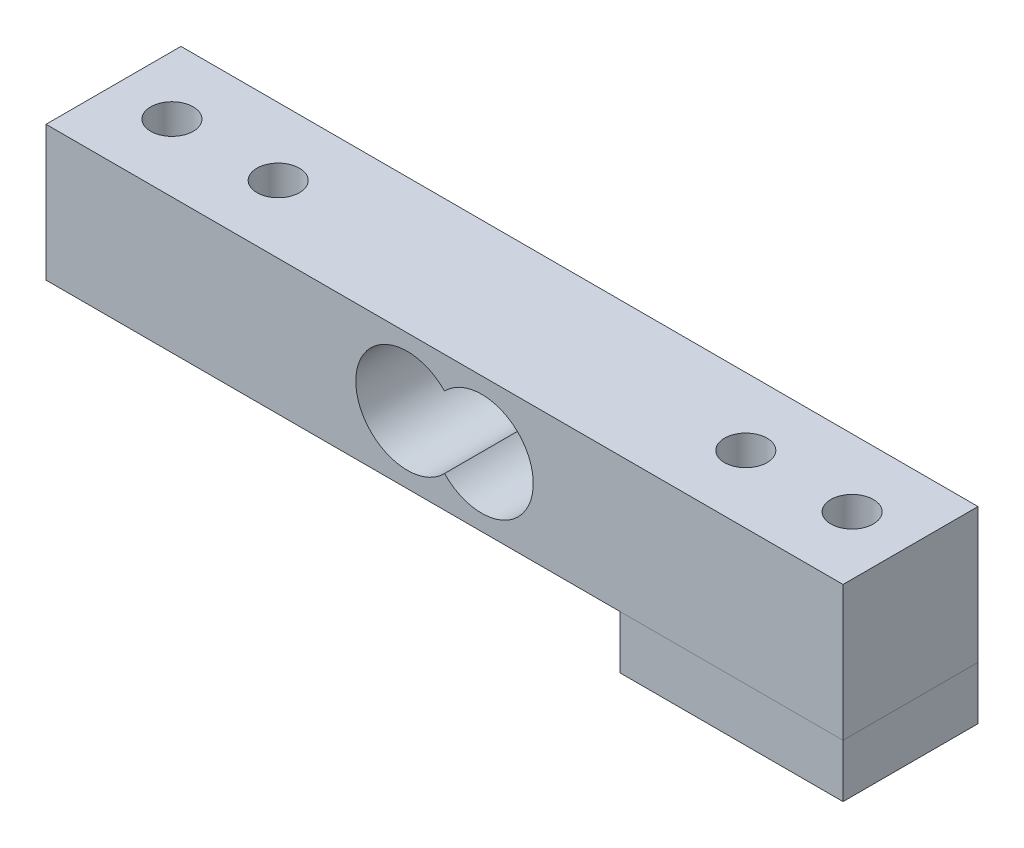
ISO-10303-21;
HEADER;
FILE_DESCRIPTION(('STEP AP214'),'2;1');
FILE_NAME('part.step','',(''),(''),'','','');
FILE_SCHEMA(('AUTOMOTIVE_DESIGN { 1 0 10303 214 1 1 1 1 }'));
ENDSEC;
DATA;
#1=APPLICATION_CONTEXT('core data for automotive mechanical design processes');
#2=APPLICATION_PROTOCOL_DEFINITION('international standard','automotive_design',2000,#1);
#3=PRODUCT_CONTEXT('',#1,'mechanical');
#4=PRODUCT('Part','Part','',(#3));
#5=PRODUCT_RELATED_PRODUCT_CATEGORY('part','',(#4));
#6=PRODUCT_DEFINITION_FORMATION('','',#4);
#7=PRODUCT_DEFINITION_CONTEXT('part definition',#1,'design');
#8=PRODUCT_DEFINITION('design','',#6,#7);
#9=PRODUCT_DEFINITION_SHAPE('','',#8);
#10=(LENGTH_UNIT() NAMED_UNIT(*) SI_UNIT(.MILLI.,.METRE.));
#11=(NAMED_UNIT(*) PLANE_ANGLE_UNIT() SI_UNIT($,.RADIAN.));
#12=(NAMED_UNIT(*) SI_UNIT($,.STERADIAN.) SOLID_ANGLE_UNIT());
#13=UNCERTAINTY_MEASURE_WITH_UNIT(LENGTH_MEASURE(1.E-05),#10,'distance_accuracy_value','');
#14=(GEOMETRIC_REPRESENTATION_CONTEXT(3) GLOBAL_UNCERTAINTY_ASSIGNED_CONTEXT((#13)) GLOBAL_UNIT_ASSIGNED_CONTEXT((#10,
#11,#12)) REPRESENTATION_CONTEXT('',''));
#15=CARTESIAN_POINT('',(0.,0.,0.));
#16=DIRECTION('',(0.,0.,1.));
#17=DIRECTION('',(1.,0.,0.));
#18=AXIS2_PLACEMENT_3D('',#15,#16,#17);
#19=CARTESIAN_POINT('',(0.,-5.,0.));
#20=DIRECTION('',(0.,-1.,0.));
#21=DIRECTION('',(0.,0.,-1.));
#22=AXIS2_PLACEMENT_3D('',#19,#20,#21);
#23=PLANE('',#22);
#24=CARTESIAN_POINT('',(32.,-5.,0.));
#25=DIRECTION('',(0.,-1.,0.));
#26=DIRECTION('',(0.,0.,-1.));
#27=AXIS2_PLACEMENT_3D('',#24,#25,#26);
#28=CIRCLE('',#27,2.25);
#29=CARTESIAN_POINT('',(32.,-5.,-2.25));
#30=VERTEX_POINT('',#29);
#31=EDGE_CURVE('E116',#30,#30,#28,.T.);
#32=ORIENTED_EDGE('',*,*,#31,.F.);
#33=EDGE_LOOP('',(#32));
#34=FACE_BOUND('',#33,.T.);
#35=DIRECTION('',(0.,0.,1.));
#36=VECTOR('',#35,1.);
#37=CARTESIAN_POINT('',(37.5,-5.,-6.35));
#38=LINE('',#37,#36);
#39=CARTESIAN_POINT('',(37.5,-5.,-6.35));
#40=VERTEX_POINT('',#39);
#41=CARTESIAN_POINT('',(37.5,-5.,6.35));
#42=VERTEX_POINT('',#41);
#43=EDGE_CURVE('E101',#40,#42,#38,.T.);
#44=ORIENTED_EDGE('',*,*,#43,.T.);
#45=DIRECTION('',(-1.,0.,0.));
#46=VECTOR('',#45,1.);
#47=CARTESIAN_POINT('',(37.5,-5.,6.35));
#48=LINE('',#47,#46);
#49=CARTESIAN_POINT('',(16.5,-5.,6.35));
#50=VERTEX_POINT('',#49);
#51=EDGE_CURVE('E96',#42,#50,#48,.T.);
#52=ORIENTED_EDGE('',*,*,#51,.T.);
#53=DIRECTION('',(0.,0.,-1.));
#54=VECTOR('',#53,1.);
#55=CARTESIAN_POINT('',(16.5,-5.,-6.35));
#56=LINE('',#55,#54);
#57=CARTESIAN_POINT('',(16.5,-5.,-6.35));
#58=VERTEX_POINT('',#57);
#59=EDGE_CURVE('E99',#50,#58,#56,.T.);
#60=ORIENTED_EDGE('',*,*,#59,.T.);
#61=DIRECTION('',(1.,0.,0.));
#62=VECTOR('',#61,1.);
#63=CARTESIAN_POINT('',(37.5,-5.,-6.35));
#64=LINE('',#63,#62);
#65=EDGE_CURVE('E66',#58,#40,#64,.T.);
#66=ORIENTED_EDGE('',*,*,#65,.T.);
#67=EDGE_LOOP('',(#44,#52,#60,#66));
#68=FACE_BOUND('',#67,.T.);
#69=CARTESIAN_POINT('',(22.,-5.,0.));
#70=DIRECTION('',(0.,-1.,0.));
#71=DIRECTION('',(0.,0.,-1.));
#72=AXIS2_PLACEMENT_3D('',#69,#70,#71);
#73=CIRCLE('',#72,2.25);
#74=CARTESIAN_POINT('',(22.,-5.,-2.25));
#75=VERTEX_POINT('',#74);
#76=EDGE_CURVE('E131',#75,#75,#73,.T.);
#77=ORIENTED_EDGE('',*,*,#76,.F.);
#78=EDGE_LOOP('',(#77));
#79=FACE_BOUND('',#78,.T.);
#80=ADVANCED_FACE('F49',(#34,#68,#79),#23,.T.);
#81=CARTESIAN_POINT('',(0.,0.,0.));
#82=DIRECTION('',(0.,-1.,0.));
#83=DIRECTION('',(0.,0.,-1.));
#84=AXIS2_PLACEMENT_3D('',#81,#82,#83);
#85=PLANE('',#84);
#86=DIRECTION('',(0.,0.,1.));
#87=VECTOR('',#86,1.);
#88=CARTESIAN_POINT('',(37.5,0.,-6.35));
#89=LINE('',#88,#87);
#90=CARTESIAN_POINT('',(37.5,0.,-6.35));
#91=VERTEX_POINT('',#90);
#92=CARTESIAN_POINT('',(37.5,0.,6.35));
#93=VERTEX_POINT('',#92);
#94=EDGE_CURVE('E113',#91,#93,#89,.T.);
#95=ORIENTED_EDGE('',*,*,#94,.F.);
#96=DIRECTION('',(1.,0.,0.));
#97=VECTOR('',#96,1.);
#98=CARTESIAN_POINT('',(37.5,0.,-6.35));
#99=LINE('',#98,#97);
#100=CARTESIAN_POINT('',(16.5,0.,-6.35));
#101=VERTEX_POINT('',#100);
#102=EDGE_CURVE('E89',#101,#91,#99,.T.);
#103=ORIENTED_EDGE('',*,*,#102,.F.);
#104=DIRECTION('',(0.,0.,-1.));
#105=VECTOR('',#104,1.);
#106=CARTESIAN_POINT('',(16.5,0.,-6.35));
#107=LINE('',#106,#105);
#108=CARTESIAN_POINT('',(16.5,0.,6.35));
#109=VERTEX_POINT('',#108);
#110=EDGE_CURVE('E83',#109,#101,#107,.T.);
#111=ORIENTED_EDGE('',*,*,#110,.F.);
#112=DIRECTION('',(-1.,0.,0.));
#113=VECTOR('',#112,1.);
#114=CARTESIAN_POINT('',(37.5,0.,6.35));
#115=LINE('',#114,#113);
#116=EDGE_CURVE('E105',#93,#109,#115,.T.);
#117=ORIENTED_EDGE('',*,*,#116,.F.);
#118=EDGE_LOOP('',(#95,#103,#111,#117));
#119=FACE_BOUND('',#118,.T.);
#120=CARTESIAN_POINT('',(32.,0.,0.));
#121=DIRECTION('',(0.,-1.,0.));
#122=DIRECTION('',(0.,0.,-1.));
#123=AXIS2_PLACEMENT_3D('',#120,#121,#122);
#124=CIRCLE('',#123,2.25);
#125=CARTESIAN_POINT('',(32.,0.,-2.25));
#126=VERTEX_POINT('',#125);
#127=EDGE_CURVE('E128',#126,#126,#124,.T.);
#128=ORIENTED_EDGE('',*,*,#127,.T.);
#129=EDGE_LOOP('',(#128));
#130=FACE_BOUND('',#129,.T.);
#131=CARTESIAN_POINT('',(22.,0.,0.));
#132=DIRECTION('',(0.,-1.,0.));
#133=DIRECTION('',(0.,0.,-1.));
#134=AXIS2_PLACEMENT_3D('',#131,#132,#133);
#135=CIRCLE('',#134,2.25);
#136=CARTESIAN_POINT('',(22.,0.,-2.25));
#137=VERTEX_POINT('',#136);
#138=EDGE_CURVE('E134',#137,#137,#135,.T.);
#139=ORIENTED_EDGE('',*,*,#138,.T.);
#140=EDGE_LOOP('',(#139));
#141=FACE_BOUND('',#140,.T.);
#142=ADVANCED_FACE('F124',(#119,#130,#141),#85,.F.);
#143=CARTESIAN_POINT('',(37.5,-5.,-6.35));
#144=DIRECTION('',(-1.,0.,0.));
#145=DIRECTION('',(0.,0.,1.));
#146=AXIS2_PLACEMENT_3D('',#143,#144,#145);
#147=PLANE('',#146);
#148=ORIENTED_EDGE('',*,*,#94,.T.);
#149=DIRECTION('',(0.,1.,0.));
#150=VECTOR('',#149,1.);
#151=CARTESIAN_POINT('',(37.5,-5.,6.35));
#152=LINE('',#151,#150);
#153=EDGE_CURVE('E12',#42,#93,#152,.T.);
#154=ORIENTED_EDGE('',*,*,#153,.F.);
#155=ORIENTED_EDGE('',*,*,#43,.F.);
#156=DIRECTION('',(0.,1.,0.));
#157=VECTOR('',#156,1.);
#158=CARTESIAN_POINT('',(37.5,-5.,-6.35));
#159=LINE('',#158,#157);
#160=EDGE_CURVE('E109',#40,#91,#159,.T.);
#161=ORIENTED_EDGE('',*,*,#160,.T.);
#162=EDGE_LOOP('',(#148,#154,#155,#161));
#163=FACE_BOUND('',#162,.T.);
#164=ADVANCED_FACE('F51',(#163),#147,.F.);
#165=CARTESIAN_POINT('',(37.5,-5.,6.35));
#166=DIRECTION('',(0.,0.,-1.));
#167=DIRECTION('',(-1.,0.,0.));
#168=AXIS2_PLACEMENT_3D('',#165,#166,#167);
#169=PLANE('',#168);
#170=ORIENTED_EDGE('',*,*,#116,.T.);
#171=DIRECTION('',(0.,1.,0.));
#172=VECTOR('',#171,1.);
#173=CARTESIAN_POINT('',(16.5,-5.,6.35));
#174=LINE('',#173,#172);
#175=EDGE_CURVE('E58',#50,#109,#174,.T.);
#176=ORIENTED_EDGE('',*,*,#175,.F.);
#177=ORIENTED_EDGE('',*,*,#51,.F.);
#178=ORIENTED_EDGE('',*,*,#153,.T.);
#179=EDGE_LOOP('',(#170,#176,#177,#178));
#180=FACE_BOUND('',#179,.T.);
#181=ADVANCED_FACE('F104',(#180),#169,.F.);
#182=CARTESIAN_POINT('',(16.5,-5.,-6.35));
#183=DIRECTION('',(1.,0.,0.));
#184=DIRECTION('',(0.,0.,-1.));
#185=AXIS2_PLACEMENT_3D('',#182,#183,#184);
#186=PLANE('',#185);
#187=ORIENTED_EDGE('',*,*,#110,.T.);
#188=DIRECTION('',(0.,1.,0.));
#189=VECTOR('',#188,1.);
#190=CARTESIAN_POINT('',(16.5,-5.,-6.35));
#191=LINE('',#190,#189);
#192=EDGE_CURVE('E106',#58,#101,#191,.T.);
#193=ORIENTED_EDGE('',*,*,#192,.F.);
#194=ORIENTED_EDGE('',*,*,#59,.F.);
#195=ORIENTED_EDGE('',*,*,#175,.T.);
#196=EDGE_LOOP('',(#187,#193,#194,#195));
#197=FACE_BOUND('',#196,.T.);
#198=ADVANCED_FACE('F107',(#197),#186,.F.);
#199=CARTESIAN_POINT('',(37.5,-5.,-6.35));
#200=DIRECTION('',(0.,0.,1.));
#201=DIRECTION('',(1.,0.,0.));
#202=AXIS2_PLACEMENT_3D('',#199,#200,#201);
#203=PLANE('',#202);
#204=ORIENTED_EDGE('',*,*,#102,.T.);
#205=ORIENTED_EDGE('',*,*,#160,.F.);
#206=ORIENTED_EDGE('',*,*,#65,.F.);
#207=ORIENTED_EDGE('',*,*,#192,.T.);
#208=EDGE_LOOP('',(#204,#205,#206,#207));
#209=FACE_BOUND('',#208,.T.);
#210=ADVANCED_FACE('F121',(#209),#203,.F.);
#211=CARTESIAN_POINT('',(32.,-5.,0.));
#212=DIRECTION('',(0.,1.,0.));
#213=DIRECTION('',(0.,0.,1.));
#214=AXIS2_PLACEMENT_3D('',#211,#212,#213);
#215=CYLINDRICAL_SURFACE('',#214,2.25);
#216=ORIENTED_EDGE('',*,*,#31,.T.);
#217=EDGE_LOOP('',(#216));
#218=FACE_BOUND('',#217,.T.);
#219=ORIENTED_EDGE('',*,*,#127,.F.);
#220=EDGE_LOOP('',(#219));
#221=FACE_BOUND('',#220,.T.);
#222=ADVANCED_FACE('F151',(#218,#221),#215,.F.);
#223=CARTESIAN_POINT('',(22.,-5.,0.));
#224=DIRECTION('',(0.,1.,0.));
#225=DIRECTION('',(0.,0.,1.));
#226=AXIS2_PLACEMENT_3D('',#223,#224,#225);
#227=CYLINDRICAL_SURFACE('',#226,2.25);
#228=ORIENTED_EDGE('',*,*,#76,.T.);
#229=EDGE_LOOP('',(#228));
#230=FACE_BOUND('',#229,.T.);
#231=ORIENTED_EDGE('',*,*,#138,.F.);
#232=EDGE_LOOP('',(#231));
#233=FACE_BOUND('',#232,.T.);
#234=ADVANCED_FACE('F140',(#230,#233),#227,.F.);
#235=CLOSED_SHELL('',(#80,#142,#164,#181,#198,#210,#222,#234));
#236=MANIFOLD_SOLID_BREP('B2',#235);
#237=CARTESIAN_POINT('',(0.,12.7,6.35));
#238=DIRECTION('',(0.,0.,-1.));
#239=DIRECTION('',(-1.,0.,0.));
#240=AXIS2_PLACEMENT_3D('',#237,#238,#239);
#241=PLANE('',#240);
#242=CARTESIAN_POINT('',(-3.5,6.35,6.35));
#243=DIRECTION('',(0.,0.,1.));
#244=DIRECTION('',(1.,0.,0.));
#245=AXIS2_PLACEMENT_3D('',#242,#243,#244);
#246=CIRCLE('',#245,4.85);
#247=CARTESIAN_POINT('',(0.,9.70745439283991,6.35));
#248=VERTEX_POINT('',#247);
#249=CARTESIAN_POINT('',(0.,2.99254560716009,6.35));
#250=VERTEX_POINT('',#249);
#251=EDGE_CURVE('E280',#248,#250,#246,.T.);
#252=ORIENTED_EDGE('',*,*,#251,.F.);
#253=CARTESIAN_POINT('',(3.5,6.35,6.35));
#254=DIRECTION('',(0.,0.,1.));
#255=DIRECTION('',(1.,0.,0.));
#256=AXIS2_PLACEMENT_3D('',#253,#254,#255);
#257=CIRCLE('',#256,4.85);
#258=EDGE_CURVE('E230',#250,#248,#257,.T.);
#259=ORIENTED_EDGE('',*,*,#258,.F.);
#260=EDGE_LOOP('',(#252,#259));
#261=FACE_BOUND('',#260,.T.);
#262=DIRECTION('',(1.,0.,0.));
#263=VECTOR('',#262,1.);
#264=CARTESIAN_POINT('',(0.,0.,6.35));
#265=LINE('',#264,#263);
#266=CARTESIAN_POINT('',(-37.5,0.,6.35));
#267=VERTEX_POINT('',#266);
#268=CARTESIAN_POINT('',(37.5,0.,6.35));
#269=VERTEX_POINT('',#268);
#270=EDGE_CURVE('E322',#267,#269,#265,.T.);
#271=ORIENTED_EDGE('',*,*,#270,.T.);
#272=DIRECTION('',(0.,-1.,0.));
#273=VECTOR('',#272,1.);
#274=CARTESIAN_POINT('',(37.5,12.7,6.35));
#275=LINE('',#274,#273);
#276=CARTESIAN_POINT('',(37.5,12.7,6.35));
#277=VERTEX_POINT('',#276);
#278=EDGE_CURVE('E47',#277,#269,#275,.T.);
#279=ORIENTED_EDGE('',*,*,#278,.F.);
#280=DIRECTION('',(1.,0.,0.));
#281=VECTOR('',#280,1.);
#282=CARTESIAN_POINT('',(0.,12.7,6.35));
#283=LINE('',#282,#281);
#284=CARTESIAN_POINT('',(-37.5,12.7,6.35));
#285=VERTEX_POINT('',#284);
#286=EDGE_CURVE('E299',#285,#277,#283,.T.);
#287=ORIENTED_EDGE('',*,*,#286,.F.);
#288=DIRECTION('',(0.,-1.,0.));
#289=VECTOR('',#288,1.);
#290=CARTESIAN_POINT('',(-37.5,12.7,6.35));
#291=LINE('',#290,#289);
#292=EDGE_CURVE('E310',#285,#267,#291,.T.);
#293=ORIENTED_EDGE('',*,*,#292,.T.);
#294=EDGE_LOOP('',(#271,#279,#287,#293));
#295=FACE_BOUND('',#294,.T.);
#296=ADVANCED_FACE('F215',(#261,#295),#241,.F.);
#297=CARTESIAN_POINT('',(37.5,12.7,0.));
#298=DIRECTION('',(-1.,0.,0.));
#299=DIRECTION('',(0.,0.,1.));
#300=AXIS2_PLACEMENT_3D('',#297,#298,#299);
#301=PLANE('',#300);
#302=DIRECTION('',(0.,0.,-1.));
#303=VECTOR('',#302,1.);
#304=CARTESIAN_POINT('',(37.5,0.,0.));
#305=LINE('',#304,#303);
#306=CARTESIAN_POINT('',(37.5,0.,-6.35));
#307=VERTEX_POINT('',#306);
#308=EDGE_CURVE('E325',#269,#307,#305,.T.);
#309=ORIENTED_EDGE('',*,*,#308,.T.);
#310=DIRECTION('',(0.,-1.,0.));
#311=VECTOR('',#310,1.);
#312=CARTESIAN_POINT('',(37.5,12.7,-6.35));
#313=LINE('',#312,#311);
#314=CARTESIAN_POINT('',(37.5,12.7,-6.35));
#315=VERTEX_POINT('',#314);
#316=EDGE_CURVE('E223',#315,#307,#313,.T.);
#317=ORIENTED_EDGE('',*,*,#316,.F.);
#318=DIRECTION('',(0.,0.,-1.));
#319=VECTOR('',#318,1.);
#320=CARTESIAN_POINT('',(37.5,12.7,0.));
#321=LINE('',#320,#319);
#322=EDGE_CURVE('E302',#277,#315,#321,.T.);
#323=ORIENTED_EDGE('',*,*,#322,.F.);
#324=ORIENTED_EDGE('',*,*,#278,.T.);
#325=EDGE_LOOP('',(#309,#317,#323,#324));
#326=FACE_BOUND('',#325,.T.);
#327=ADVANCED_FACE('F339',(#326),#301,.F.);
#328=CARTESIAN_POINT('',(0.,12.7,-6.35));
#329=DIRECTION('',(0.,0.,-1.));
#330=DIRECTION('',(-1.,0.,0.));
#331=AXIS2_PLACEMENT_3D('',#328,#329,#330);
#332=PLANE('',#331);
#333=CARTESIAN_POINT('',(3.5,6.35,-6.35));
#334=DIRECTION('',(0.,0.,-1.));
#335=DIRECTION('',(-1.,0.,0.));
#336=AXIS2_PLACEMENT_3D('',#333,#334,#335);
#337=CIRCLE('',#336,4.85);
#338=CARTESIAN_POINT('',(0.,2.99254560716009,-6.35));
#339=VERTEX_POINT('',#338);
#340=CARTESIAN_POINT('',(0.,9.70745439283991,-6.35));
#341=VERTEX_POINT('',#340);
#342=EDGE_CURVE('E275',#339,#341,#337,.F.);
#343=ORIENTED_EDGE('',*,*,#342,.T.);
#344=CARTESIAN_POINT('',(-3.5,6.35,-6.35));
#345=DIRECTION('',(0.,0.,-1.));
#346=DIRECTION('',(-1.,0.,0.));
#347=AXIS2_PLACEMENT_3D('',#344,#345,#346);
#348=CIRCLE('',#347,4.85);
#349=EDGE_CURVE('E267',#341,#339,#348,.F.);
#350=ORIENTED_EDGE('',*,*,#349,.T.);
#351=EDGE_LOOP('',(#343,#350));
#352=FACE_BOUND('',#351,.T.);
#353=DIRECTION('',(1.,0.,0.));
#354=VECTOR('',#353,1.);
#355=CARTESIAN_POINT('',(0.,0.,-6.35));
#356=LINE('',#355,#354);
#357=CARTESIAN_POINT('',(-37.5,0.,-6.35));
#358=VERTEX_POINT('',#357);
#359=EDGE_CURVE('E328',#358,#307,#356,.T.);
#360=ORIENTED_EDGE('',*,*,#359,.F.);
#361=DIRECTION('',(0.,-1.,0.));
#362=VECTOR('',#361,1.);
#363=CARTESIAN_POINT('',(-37.5,12.7,-6.35));
#364=LINE('',#363,#362);
#365=CARTESIAN_POINT('',(-37.5,12.7,-6.35));
#366=VERTEX_POINT('',#365);
#367=EDGE_CURVE('E334',#366,#358,#364,.T.);
#368=ORIENTED_EDGE('',*,*,#367,.F.);
#369=DIRECTION('',(1.,0.,0.));
#370=VECTOR('',#369,1.);
#371=CARTESIAN_POINT('',(0.,12.7,-6.35));
#372=LINE('',#371,#370);
#373=EDGE_CURVE('E304',#366,#315,#372,.T.);
#374=ORIENTED_EDGE('',*,*,#373,.T.);
#375=ORIENTED_EDGE('',*,*,#316,.T.);
#376=EDGE_LOOP('',(#360,#368,#374,#375));
#377=FACE_BOUND('',#376,.T.);
#378=ADVANCED_FACE('F277',(#352,#377),#332,.T.);
#379=CARTESIAN_POINT('',(-32.,12.7,0.));
#380=DIRECTION('',(0.,-1.,0.));
#381=DIRECTION('',(0.,0.,-1.));
#382=AXIS2_PLACEMENT_3D('',#379,#380,#381);
#383=CYLINDRICAL_SURFACE('',#382,2.);
#384=CARTESIAN_POINT('',(-32.,12.7,0.));
#385=DIRECTION('',(0.,1.,0.));
#386=DIRECTION('',(0.,0.,1.));
#387=AXIS2_PLACEMENT_3D('',#384,#385,#386);
#388=CIRCLE('',#387,2.);
#389=CARTESIAN_POINT('',(-32.,12.7,2.));
#390=VERTEX_POINT('',#389);
#391=EDGE_CURVE('E296',#390,#390,#388,.T.);
#392=ORIENTED_EDGE('',*,*,#391,.T.);
#393=EDGE_LOOP('',(#392));
#394=FACE_BOUND('',#393,.T.);
#395=CARTESIAN_POINT('',(-32.,0.,0.));
#396=DIRECTION('',(0.,1.,0.));
#397=DIRECTION('',(0.,0.,1.));
#398=AXIS2_PLACEMENT_3D('',#395,#396,#397);
#399=CIRCLE('',#398,2.);
#400=CARTESIAN_POINT('',(-32.,0.,2.));
#401=VERTEX_POINT('',#400);
#402=EDGE_CURVE('E319',#401,#401,#399,.T.);
#403=ORIENTED_EDGE('',*,*,#402,.F.);
#404=EDGE_LOOP('',(#403));
#405=FACE_BOUND('',#404,.T.);
#406=ADVANCED_FACE('F361',(#394,#405),#383,.F.);
#407=CARTESIAN_POINT('',(-22.,12.7,0.));
#408=DIRECTION('',(0.,-1.,0.));
#409=DIRECTION('',(0.,0.,-1.));
#410=AXIS2_PLACEMENT_3D('',#407,#408,#409);
#411=CYLINDRICAL_SURFACE('',#410,2.);
#412=CARTESIAN_POINT('',(-22.,12.7,0.));
#413=DIRECTION('',(0.,1.,0.));
#414=DIRECTION('',(0.,0.,1.));
#415=AXIS2_PLACEMENT_3D('',#412,#413,#414);
#416=CIRCLE('',#415,2.);
#417=CARTESIAN_POINT('',(-22.,12.7,2.));
#418=VERTEX_POINT('',#417);
#419=EDGE_CURVE('E293',#418,#418,#416,.T.);
#420=ORIENTED_EDGE('',*,*,#419,.T.);
#421=EDGE_LOOP('',(#420));
#422=FACE_BOUND('',#421,.T.);
#423=CARTESIAN_POINT('',(-22.,0.,0.));
#424=DIRECTION('',(0.,1.,0.));
#425=DIRECTION('',(0.,0.,1.));
#426=AXIS2_PLACEMENT_3D('',#423,#424,#425);
#427=CIRCLE('',#426,2.);
#428=CARTESIAN_POINT('',(-22.,0.,2.));
#429=VERTEX_POINT('',#428);
#430=EDGE_CURVE('E316',#429,#429,#427,.T.);
#431=ORIENTED_EDGE('',*,*,#430,.F.);
#432=EDGE_LOOP('',(#431));
#433=FACE_BOUND('',#432,.T.);
#434=ADVANCED_FACE('F364',(#422,#433),#411,.F.);
#435=CARTESIAN_POINT('',(22.,12.7,0.));
#436=DIRECTION('',(0.,-1.,0.));
#437=DIRECTION('',(0.,0.,-1.));
#438=AXIS2_PLACEMENT_3D('',#435,#436,#437);
#439=CYLINDRICAL_SURFACE('',#438,2.);
#440=CARTESIAN_POINT('',(22.,12.7,0.));
#441=DIRECTION('',(0.,1.,0.));
#442=DIRECTION('',(0.,0.,1.));
#443=AXIS2_PLACEMENT_3D('',#440,#441,#442);
#444=CIRCLE('',#443,2.);
#445=CARTESIAN_POINT('',(22.,12.7,2.));
#446=VERTEX_POINT('',#445);
#447=EDGE_CURVE('E289',#446,#446,#444,.T.);
#448=ORIENTED_EDGE('',*,*,#447,.T.);
#449=EDGE_LOOP('',(#448));
#450=FACE_BOUND('',#449,.T.);
#451=CARTESIAN_POINT('',(22.,0.,0.));
#452=DIRECTION('',(0.,1.,0.));
#453=DIRECTION('',(0.,0.,1.));
#454=AXIS2_PLACEMENT_3D('',#451,#452,#453);
#455=CIRCLE('',#454,2.);
#456=CARTESIAN_POINT('',(22.,0.,2.));
#457=VERTEX_POINT('',#456);
#458=EDGE_CURVE('E313',#457,#457,#455,.T.);
#459=ORIENTED_EDGE('',*,*,#458,.F.);
#460=EDGE_LOOP('',(#459));
#461=FACE_BOUND('',#460,.T.);
#462=ADVANCED_FACE('F367',(#450,#461),#439,.F.);
#463=CARTESIAN_POINT('',(32.,12.7,0.));
#464=DIRECTION('',(0.,-1.,0.));
#465=DIRECTION('',(0.,0.,-1.));
#466=AXIS2_PLACEMENT_3D('',#463,#464,#465);
#467=CYLINDRICAL_SURFACE('',#466,2.);
#468=CARTESIAN_POINT('',(32.,12.7,0.));
#469=DIRECTION('',(0.,1.,0.));
#470=DIRECTION('',(0.,0.,1.));
#471=AXIS2_PLACEMENT_3D('',#468,#469,#470);
#472=CIRCLE('',#471,2.);
#473=CARTESIAN_POINT('',(32.,12.7,2.));
#474=VERTEX_POINT('',#473);
#475=EDGE_CURVE('E286',#474,#474,#472,.T.);
#476=ORIENTED_EDGE('',*,*,#475,.T.);
#477=EDGE_LOOP('',(#476));
#478=FACE_BOUND('',#477,.T.);
#479=CARTESIAN_POINT('',(32.,0.,0.));
#480=DIRECTION('',(0.,1.,0.));
#481=DIRECTION('',(0.,0.,1.));
#482=AXIS2_PLACEMENT_3D('',#479,#480,#481);
#483=CIRCLE('',#482,2.);
#484=CARTESIAN_POINT('',(32.,0.,2.));
#485=VERTEX_POINT('',#484);
#486=EDGE_CURVE('E285',#485,#485,#483,.T.);
#487=ORIENTED_EDGE('',*,*,#486,.F.);
#488=EDGE_LOOP('',(#487));
#489=FACE_BOUND('',#488,.T.);
#490=ADVANCED_FACE('F217',(#478,#489),#467,.F.);
#491=CARTESIAN_POINT('',(-37.5,12.7,0.));
#492=DIRECTION('',(-1.,0.,0.));
#493=DIRECTION('',(0.,0.,1.));
#494=AXIS2_PLACEMENT_3D('',#491,#492,#493);
#495=PLANE('',#494);
#496=DIRECTION('',(0.,0.,-1.));
#497=VECTOR('',#496,1.);
#498=CARTESIAN_POINT('',(-37.5,0.,0.));
#499=LINE('',#498,#497);
#500=EDGE_CURVE('E290',#267,#358,#499,.T.);
#501=ORIENTED_EDGE('',*,*,#500,.F.);
#502=ORIENTED_EDGE('',*,*,#292,.F.);
#503=DIRECTION('',(0.,0.,-1.));
#504=VECTOR('',#503,1.);
#505=CARTESIAN_POINT('',(-37.5,12.7,0.));
#506=LINE('',#505,#504);
#507=EDGE_CURVE('E307',#285,#366,#506,.T.);
#508=ORIENTED_EDGE('',*,*,#507,.T.);
#509=ORIENTED_EDGE('',*,*,#367,.T.);
#510=EDGE_LOOP('',(#501,#502,#508,#509));
#511=FACE_BOUND('',#510,.T.);
#512=ADVANCED_FACE('F346',(#511),#495,.T.);
#513=CARTESIAN_POINT('',(0.,12.7,0.));
#514=DIRECTION('',(0.,1.,0.));
#515=DIRECTION('',(0.,0.,1.));
#516=AXIS2_PLACEMENT_3D('',#513,#514,#515);
#517=PLANE('',#516);
#518=ORIENTED_EDGE('',*,*,#475,.F.);
#519=EDGE_LOOP('',(#518));
#520=FACE_BOUND('',#519,.T.);
#521=ORIENTED_EDGE('',*,*,#447,.F.);
#522=EDGE_LOOP('',(#521));
#523=FACE_BOUND('',#522,.T.);
#524=ORIENTED_EDGE('',*,*,#419,.F.);
#525=EDGE_LOOP('',(#524));
#526=FACE_BOUND('',#525,.T.);
#527=ORIENTED_EDGE('',*,*,#391,.F.);
#528=EDGE_LOOP('',(#527));
#529=FACE_BOUND('',#528,.T.);
#530=ORIENTED_EDGE('',*,*,#286,.T.);
#531=ORIENTED_EDGE('',*,*,#322,.T.);
#532=ORIENTED_EDGE('',*,*,#373,.F.);
#533=ORIENTED_EDGE('',*,*,#507,.F.);
#534=EDGE_LOOP('',(#530,#531,#532,#533));
#535=FACE_BOUND('',#534,.T.);
#536=ADVANCED_FACE('F350',(#520,#523,#526,#529,#535),#517,.T.);
#537=CARTESIAN_POINT('',(0.,0.,0.));
#538=DIRECTION('',(0.,1.,0.));
#539=DIRECTION('',(0.,0.,1.));
#540=AXIS2_PLACEMENT_3D('',#537,#538,#539);
#541=PLANE('',#540);
#542=ORIENTED_EDGE('',*,*,#486,.T.);
#543=EDGE_LOOP('',(#542));
#544=FACE_BOUND('',#543,.T.);
#545=ORIENTED_EDGE('',*,*,#458,.T.);
#546=EDGE_LOOP('',(#545));
#547=FACE_BOUND('',#546,.T.);
#548=ORIENTED_EDGE('',*,*,#430,.T.);
#549=EDGE_LOOP('',(#548));
#550=FACE_BOUND('',#549,.T.);
#551=ORIENTED_EDGE('',*,*,#402,.T.);
#552=EDGE_LOOP('',(#551));
#553=FACE_BOUND('',#552,.T.);
#554=ORIENTED_EDGE('',*,*,#270,.F.);
#555=ORIENTED_EDGE('',*,*,#500,.T.);
#556=ORIENTED_EDGE('',*,*,#359,.T.);
#557=ORIENTED_EDGE('',*,*,#308,.F.);
#558=EDGE_LOOP('',(#554,#555,#556,#557));
#559=FACE_BOUND('',#558,.T.);
#560=ADVANCED_FACE('F343',(#544,#547,#550,#553,#559),#541,.F.);
#561=CARTESIAN_POINT('',(3.5,6.35,-25.6626901285139));
#562=DIRECTION('',(0.,0.,1.));
#563=DIRECTION('',(1.,0.,0.));
#564=AXIS2_PLACEMENT_3D('',#561,#562,#563);
#565=CYLINDRICAL_SURFACE('',#564,4.85);
#566=DIRECTION('',(0.,0.,1.));
#567=VECTOR('',#566,1.);
#568=CARTESIAN_POINT('',(0.,2.99254560716009,-25.6626901285139));
#569=LINE('',#568,#567);
#570=EDGE_CURVE('E237',#339,#250,#569,.T.);
#571=ORIENTED_EDGE('',*,*,#570,.T.);
#572=ORIENTED_EDGE('',*,*,#258,.T.);
#573=DIRECTION('',(0.,0.,1.));
#574=VECTOR('',#573,1.);
#575=CARTESIAN_POINT('',(0.,9.70745439283991,-25.6626901285139));
#576=LINE('',#575,#574);
#577=EDGE_CURVE('E269',#341,#248,#576,.T.);
#578=ORIENTED_EDGE('',*,*,#577,.F.);
#579=ORIENTED_EDGE('',*,*,#342,.F.);
#580=EDGE_LOOP('',(#571,#572,#578,#579));
#581=FACE_BOUND('',#580,.T.);
#582=ADVANCED_FACE('F274',(#581),#565,.F.);
#583=CARTESIAN_POINT('',(-3.5,6.35,-25.6626901285139));
#584=DIRECTION('',(0.,0.,1.));
#585=DIRECTION('',(1.,0.,0.));
#586=AXIS2_PLACEMENT_3D('',#583,#584,#585);
#587=CYLINDRICAL_SURFACE('',#586,4.85);
#588=ORIENTED_EDGE('',*,*,#577,.T.);
#589=ORIENTED_EDGE('',*,*,#251,.T.);
#590=ORIENTED_EDGE('',*,*,#570,.F.);
#591=ORIENTED_EDGE('',*,*,#349,.F.);
#592=EDGE_LOOP('',(#588,#589,#590,#591));
#593=FACE_BOUND('',#592,.T.);
#594=ADVANCED_FACE('F268',(#593),#587,.F.);
#595=CLOSED_SHELL('',(#296,#327,#378,#406,#434,#462,#490,#512,#536,#560,#582,#594));
#596=MANIFOLD_SOLID_BREP('B6',#595);
#597=ADVANCED_BREP_SHAPE_REPRESENTATION('',(#18,#236,#596),#14);
#598=SHAPE_DEFINITION_REPRESENTATION(#9,#597);
ENDSEC;
END-ISO-10303-21;
